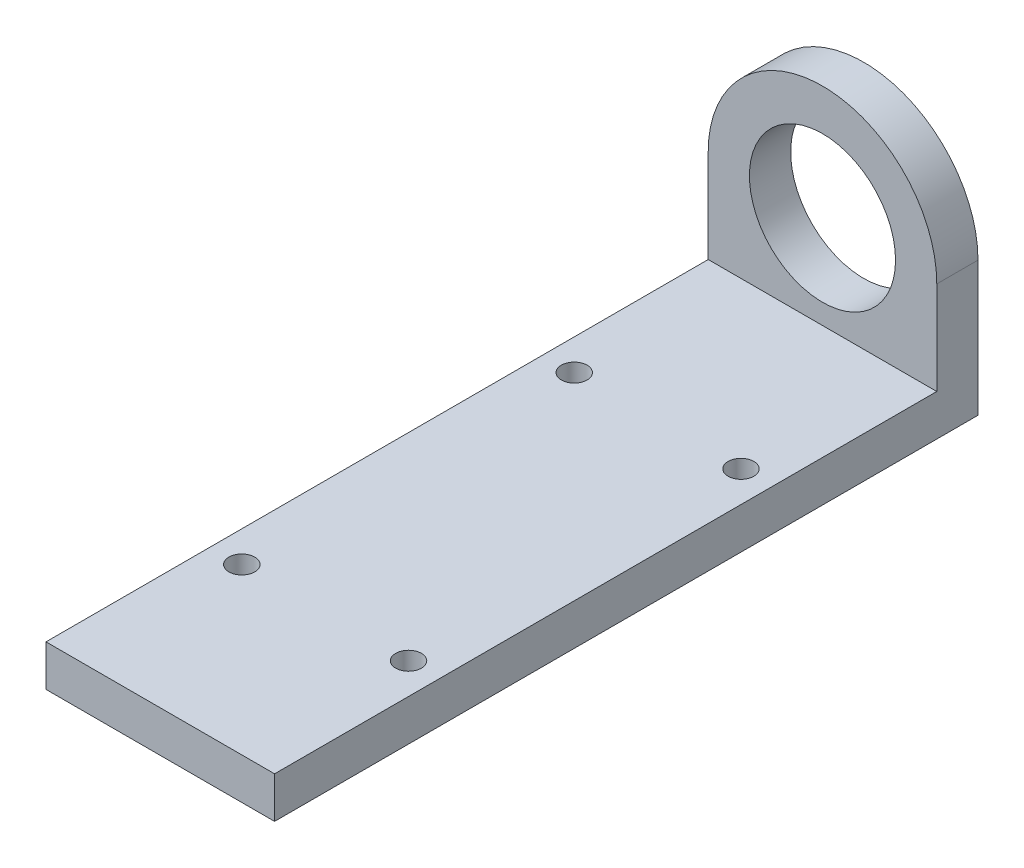
ISO-10303-21;
HEADER;
FILE_DESCRIPTION(('STEP AP214'),'2;1');
FILE_NAME('part.step','',(''),(''),'','','');
FILE_SCHEMA(('AUTOMOTIVE_DESIGN { 1 0 10303 214 1 1 1 1 }'));
ENDSEC;
DATA;
#1=APPLICATION_CONTEXT('core data for automotive mechanical design processes');
#2=APPLICATION_PROTOCOL_DEFINITION('international standard','automotive_design',2000,#1);
#3=PRODUCT_CONTEXT('',#1,'mechanical');
#4=PRODUCT('Part','Part','',(#3));
#5=PRODUCT_RELATED_PRODUCT_CATEGORY('part','',(#4));
#6=PRODUCT_DEFINITION_FORMATION('','',#4);
#7=PRODUCT_DEFINITION_CONTEXT('part definition',#1,'design');
#8=PRODUCT_DEFINITION('design','',#6,#7);
#9=PRODUCT_DEFINITION_SHAPE('','',#8);
#10=(LENGTH_UNIT() NAMED_UNIT(*) SI_UNIT(.MILLI.,.METRE.));
#11=(NAMED_UNIT(*) PLANE_ANGLE_UNIT() SI_UNIT($,.RADIAN.));
#12=(NAMED_UNIT(*) SI_UNIT($,.STERADIAN.) SOLID_ANGLE_UNIT());
#13=UNCERTAINTY_MEASURE_WITH_UNIT(LENGTH_MEASURE(1.E-05),#10,'distance_accuracy_value','');
#14=(GEOMETRIC_REPRESENTATION_CONTEXT(3) GLOBAL_UNCERTAINTY_ASSIGNED_CONTEXT((#13)) GLOBAL_UNIT_ASSIGNED_CONTEXT((#10,
#11,#12)) REPRESENTATION_CONTEXT('',''));
#15=CARTESIAN_POINT('',(0.,0.,0.));
#16=DIRECTION('',(0.,0.,1.));
#17=DIRECTION('',(1.,0.,0.));
#18=AXIS2_PLACEMENT_3D('',#15,#16,#17);
#19=CARTESIAN_POINT('',(0.,0.,6.35));
#20=DIRECTION('',(0.,0.,1.));
#21=DIRECTION('',(1.,0.,0.));
#22=AXIS2_PLACEMENT_3D('',#19,#20,#21);
#23=PLANE('',#22);
#24=DIRECTION('',(-1.,0.,0.));
#25=VECTOR('',#24,1.);
#26=CARTESIAN_POINT('',(-17.604,-14.35,6.35));
#27=LINE('',#26,#25);
#28=CARTESIAN_POINT('',(17.604,-14.35,6.35));
#29=VERTEX_POINT('',#28);
#30=CARTESIAN_POINT('',(-17.604,-14.35,6.35));
#31=VERTEX_POINT('',#30);
#32=EDGE_CURVE('E54',#29,#31,#27,.T.);
#33=ORIENTED_EDGE('',*,*,#32,.F.);
#34=DIRECTION('',(0.,1.,0.));
#35=VECTOR('',#34,1.);
#36=CARTESIAN_POINT('',(17.604,-20.7,6.35));
#37=LINE('',#36,#35);
#38=CARTESIAN_POINT('',(17.604,0.,6.35));
#39=VERTEX_POINT('',#38);
#40=EDGE_CURVE('E59',#29,#39,#37,.T.);
#41=ORIENTED_EDGE('',*,*,#40,.T.);
#42=CARTESIAN_POINT('',(0.,0.,6.35));
#43=DIRECTION('',(0.,0.,1.));
#44=DIRECTION('',(1.,0.,0.));
#45=AXIS2_PLACEMENT_3D('',#42,#43,#44);
#46=CIRCLE('',#45,17.604);
#47=CARTESIAN_POINT('',(-17.604,0.,6.35));
#48=VERTEX_POINT('',#47);
#49=EDGE_CURVE('E90',#39,#48,#46,.T.);
#50=ORIENTED_EDGE('',*,*,#49,.T.);
#51=DIRECTION('',(0.,-1.,0.));
#52=VECTOR('',#51,1.);
#53=CARTESIAN_POINT('',(-17.604,0.,6.35));
#54=LINE('',#53,#52);
#55=EDGE_CURVE('E158',#48,#31,#54,.T.);
#56=ORIENTED_EDGE('',*,*,#55,.T.);
#57=EDGE_LOOP('',(#33,#41,#50,#56));
#58=FACE_BOUND('',#57,.T.);
#59=CARTESIAN_POINT('',(0.,0.,6.35));
#60=DIRECTION('',(0.,0.,1.));
#61=DIRECTION('',(1.,0.,0.));
#62=AXIS2_PLACEMENT_3D('',#59,#60,#61);
#63=CIRCLE('',#62,11.254);
#64=CARTESIAN_POINT('',(11.254,0.,6.35));
#65=VERTEX_POINT('',#64);
#66=EDGE_CURVE('E101',#65,#65,#63,.T.);
#67=ORIENTED_EDGE('',*,*,#66,.F.);
#68=EDGE_LOOP('',(#67));
#69=FACE_BOUND('',#68,.T.);
#70=ADVANCED_FACE('F39',(#58,#69),#23,.T.);
#71=CARTESIAN_POINT('',(0.,0.,0.));
#72=DIRECTION('',(0.,0.,1.));
#73=DIRECTION('',(1.,0.,0.));
#74=AXIS2_PLACEMENT_3D('',#71,#72,#73);
#75=PLANE('',#74);
#76=CARTESIAN_POINT('',(0.,0.,0.));
#77=DIRECTION('',(0.,0.,1.));
#78=DIRECTION('',(1.,0.,0.));
#79=AXIS2_PLACEMENT_3D('',#76,#77,#78);
#80=CIRCLE('',#79,17.604);
#81=CARTESIAN_POINT('',(17.604,0.,0.));
#82=VERTEX_POINT('',#81);
#83=CARTESIAN_POINT('',(-17.604,0.,0.));
#84=VERTEX_POINT('',#83);
#85=EDGE_CURVE('E96',#82,#84,#80,.T.);
#86=ORIENTED_EDGE('',*,*,#85,.F.);
#87=DIRECTION('',(0.,1.,0.));
#88=VECTOR('',#87,1.);
#89=CARTESIAN_POINT('',(17.604,-20.7,0.));
#90=LINE('',#89,#88);
#91=CARTESIAN_POINT('',(17.604,-20.7,0.));
#92=VERTEX_POINT('',#91);
#93=EDGE_CURVE('E79',#92,#82,#90,.T.);
#94=ORIENTED_EDGE('',*,*,#93,.F.);
#95=DIRECTION('',(1.,0.,0.));
#96=VECTOR('',#95,1.);
#97=CARTESIAN_POINT('',(-17.604,-20.7,0.));
#98=LINE('',#97,#96);
#99=CARTESIAN_POINT('',(-17.604,-20.7,0.));
#100=VERTEX_POINT('',#99);
#101=EDGE_CURVE('E91',#100,#92,#98,.T.);
#102=ORIENTED_EDGE('',*,*,#101,.F.);
#103=DIRECTION('',(0.,-1.,0.));
#104=VECTOR('',#103,1.);
#105=CARTESIAN_POINT('',(-17.604,0.,0.));
#106=LINE('',#105,#104);
#107=EDGE_CURVE('E100',#84,#100,#106,.T.);
#108=ORIENTED_EDGE('',*,*,#107,.F.);
#109=EDGE_LOOP('',(#86,#94,#102,#108));
#110=FACE_BOUND('',#109,.T.);
#111=CARTESIAN_POINT('',(0.,0.,0.));
#112=DIRECTION('',(0.,0.,1.));
#113=DIRECTION('',(1.,0.,0.));
#114=AXIS2_PLACEMENT_3D('',#111,#112,#113);
#115=CIRCLE('',#114,11.254);
#116=CARTESIAN_POINT('',(11.254,0.,0.));
#117=VERTEX_POINT('',#116);
#118=EDGE_CURVE('E105',#117,#117,#115,.T.);
#119=ORIENTED_EDGE('',*,*,#118,.T.);
#120=EDGE_LOOP('',(#119));
#121=FACE_BOUND('',#120,.T.);
#122=ADVANCED_FACE('F98',(#110,#121),#75,.F.);
#123=CARTESIAN_POINT('',(0.,0.,6.35));
#124=DIRECTION('',(0.,0.,-1.));
#125=DIRECTION('',(-1.,0.,0.));
#126=AXIS2_PLACEMENT_3D('',#123,#124,#125);
#127=CYLINDRICAL_SURFACE('',#126,17.604);
#128=ORIENTED_EDGE('',*,*,#85,.T.);
#129=DIRECTION('',(0.,0.,-1.));
#130=VECTOR('',#129,1.);
#131=CARTESIAN_POINT('',(-17.604,0.,6.35));
#132=LINE('',#131,#130);
#133=EDGE_CURVE('E11',#48,#84,#132,.T.);
#134=ORIENTED_EDGE('',*,*,#133,.F.);
#135=ORIENTED_EDGE('',*,*,#49,.F.);
#136=DIRECTION('',(0.,0.,-1.));
#137=VECTOR('',#136,1.);
#138=CARTESIAN_POINT('',(17.604,0.,6.35));
#139=LINE('',#138,#137);
#140=EDGE_CURVE('E82',#39,#82,#139,.T.);
#141=ORIENTED_EDGE('',*,*,#140,.T.);
#142=EDGE_LOOP('',(#128,#134,#135,#141));
#143=FACE_BOUND('',#142,.T.);
#144=ADVANCED_FACE('F41',(#143),#127,.T.);
#145=CARTESIAN_POINT('',(-17.604,0.,6.35));
#146=DIRECTION('',(1.,0.,0.));
#147=DIRECTION('',(0.,1.,0.));
#148=AXIS2_PLACEMENT_3D('',#145,#146,#147);
#149=PLANE('',#148);
#150=ORIENTED_EDGE('',*,*,#107,.T.);
#151=DIRECTION('',(0.,0.,-1.));
#152=VECTOR('',#151,1.);
#153=CARTESIAN_POINT('',(-17.604,-20.7,6.35));
#154=LINE('',#153,#152);
#155=CARTESIAN_POINT('',(-17.604,-20.7,108.35));
#156=VERTEX_POINT('',#155);
#157=EDGE_CURVE('E47',#156,#100,#154,.T.);
#158=ORIENTED_EDGE('',*,*,#157,.F.);
#159=DIRECTION('',(0.,-1.,0.));
#160=VECTOR('',#159,1.);
#161=CARTESIAN_POINT('',(-17.604,-20.7,108.35));
#162=LINE('',#161,#160);
#163=CARTESIAN_POINT('',(-17.604,-14.35,108.35));
#164=VERTEX_POINT('',#163);
#165=EDGE_CURVE('E124',#164,#156,#162,.T.);
#166=ORIENTED_EDGE('',*,*,#165,.F.);
#167=DIRECTION('',(0.,0.,-1.));
#168=VECTOR('',#167,1.);
#169=CARTESIAN_POINT('',(-17.604,-14.35,144.126050145314));
#170=LINE('',#169,#168);
#171=EDGE_CURVE('E136',#164,#31,#170,.T.);
#172=ORIENTED_EDGE('',*,*,#171,.T.);
#173=ORIENTED_EDGE('',*,*,#55,.F.);
#174=ORIENTED_EDGE('',*,*,#133,.T.);
#175=EDGE_LOOP('',(#150,#158,#166,#172,#173,#174));
#176=FACE_BOUND('',#175,.T.);
#177=ADVANCED_FACE('F122',(#176),#149,.F.);
#178=CARTESIAN_POINT('',(-17.604,-20.7,6.35));
#179=DIRECTION('',(0.,1.,0.));
#180=DIRECTION('',(0.,0.,1.));
#181=AXIS2_PLACEMENT_3D('',#178,#179,#180);
#182=PLANE('',#181);
#183=CARTESIAN_POINT('',(-12.8415,-20.7,31.75));
#184=DIRECTION('',(0.,1.,0.));
#185=DIRECTION('',(0.,0.,-1.));
#186=AXIS2_PLACEMENT_3D('',#183,#184,#185);
#187=CIRCLE('',#186,1.984375);
#188=CARTESIAN_POINT('',(-12.8415,-20.7,29.765625));
#189=VERTEX_POINT('',#188);
#190=EDGE_CURVE('E289',#189,#189,#187,.T.);
#191=ORIENTED_EDGE('',*,*,#190,.T.);
#192=EDGE_LOOP('',(#191));
#193=FACE_BOUND('',#192,.T.);
#194=CARTESIAN_POINT('',(-12.8415,-20.7,82.95));
#195=DIRECTION('',(0.,1.,0.));
#196=DIRECTION('',(0.,0.,-1.));
#197=AXIS2_PLACEMENT_3D('',#194,#195,#196);
#198=CIRCLE('',#197,1.984375);
#199=CARTESIAN_POINT('',(-12.8415,-20.7,80.965625));
#200=VERTEX_POINT('',#199);
#201=EDGE_CURVE('E293',#200,#200,#198,.T.);
#202=ORIENTED_EDGE('',*,*,#201,.T.);
#203=EDGE_LOOP('',(#202));
#204=FACE_BOUND('',#203,.T.);
#205=CARTESIAN_POINT('',(12.8415,-20.7,82.95));
#206=DIRECTION('',(0.,1.,0.));
#207=DIRECTION('',(0.,0.,1.));
#208=AXIS2_PLACEMENT_3D('',#205,#206,#207);
#209=CIRCLE('',#208,1.984375);
#210=CARTESIAN_POINT('',(12.8415,-20.7,84.934375));
#211=VERTEX_POINT('',#210);
#212=EDGE_CURVE('E308',#211,#211,#209,.T.);
#213=ORIENTED_EDGE('',*,*,#212,.T.);
#214=EDGE_LOOP('',(#213));
#215=FACE_BOUND('',#214,.T.);
#216=CARTESIAN_POINT('',(12.8415,-20.7,31.75));
#217=DIRECTION('',(0.,1.,0.));
#218=DIRECTION('',(0.,0.,1.));
#219=AXIS2_PLACEMENT_3D('',#216,#217,#218);
#220=CIRCLE('',#219,1.984375);
#221=CARTESIAN_POINT('',(12.8415,-20.7,33.734375));
#222=VERTEX_POINT('',#221);
#223=EDGE_CURVE('E156',#222,#222,#220,.T.);
#224=ORIENTED_EDGE('',*,*,#223,.T.);
#225=EDGE_LOOP('',(#224));
#226=FACE_BOUND('',#225,.T.);
#227=ORIENTED_EDGE('',*,*,#101,.T.);
#228=DIRECTION('',(0.,0.,-1.));
#229=VECTOR('',#228,1.);
#230=CARTESIAN_POINT('',(17.604,-20.7,6.35));
#231=LINE('',#230,#229);
#232=CARTESIAN_POINT('',(17.604,-20.7,108.35));
#233=VERTEX_POINT('',#232);
#234=EDGE_CURVE('E86',#233,#92,#231,.T.);
#235=ORIENTED_EDGE('',*,*,#234,.F.);
#236=DIRECTION('',(1.,0.,0.));
#237=VECTOR('',#236,1.);
#238=CARTESIAN_POINT('',(-17.604,-20.7,108.35));
#239=LINE('',#238,#237);
#240=EDGE_CURVE('E118',#156,#233,#239,.T.);
#241=ORIENTED_EDGE('',*,*,#240,.F.);
#242=ORIENTED_EDGE('',*,*,#157,.T.);
#243=EDGE_LOOP('',(#227,#235,#241,#242));
#244=FACE_BOUND('',#243,.T.);
#245=ADVANCED_FACE('F115',(#193,#204,#215,#226,#244),#182,.F.);
#246=CARTESIAN_POINT('',(17.604,-20.7,6.35));
#247=DIRECTION('',(-1.,0.,0.));
#248=DIRECTION('',(0.,-1.,0.));
#249=AXIS2_PLACEMENT_3D('',#246,#247,#248);
#250=PLANE('',#249);
#251=ORIENTED_EDGE('',*,*,#93,.T.);
#252=ORIENTED_EDGE('',*,*,#140,.F.);
#253=ORIENTED_EDGE('',*,*,#40,.F.);
#254=DIRECTION('',(0.,0.,-1.));
#255=VECTOR('',#254,1.);
#256=CARTESIAN_POINT('',(17.604,-14.35,144.126050145314));
#257=LINE('',#256,#255);
#258=CARTESIAN_POINT('',(17.604,-14.35,108.35));
#259=VERTEX_POINT('',#258);
#260=EDGE_CURVE('E139',#259,#29,#257,.T.);
#261=ORIENTED_EDGE('',*,*,#260,.F.);
#262=DIRECTION('',(0.,1.,0.));
#263=VECTOR('',#262,1.);
#264=CARTESIAN_POINT('',(17.604,-20.7,108.35));
#265=LINE('',#264,#263);
#266=EDGE_CURVE('E141',#233,#259,#265,.T.);
#267=ORIENTED_EDGE('',*,*,#266,.F.);
#268=ORIENTED_EDGE('',*,*,#234,.T.);
#269=EDGE_LOOP('',(#251,#252,#253,#261,#267,#268));
#270=FACE_BOUND('',#269,.T.);
#271=ADVANCED_FACE('F81',(#270),#250,.F.);
#272=CARTESIAN_POINT('',(0.,0.,6.35));
#273=DIRECTION('',(0.,0.,-1.));
#274=DIRECTION('',(-1.,0.,0.));
#275=AXIS2_PLACEMENT_3D('',#272,#273,#274);
#276=CYLINDRICAL_SURFACE('',#275,11.254);
#277=ORIENTED_EDGE('',*,*,#66,.T.);
#278=EDGE_LOOP('',(#277));
#279=FACE_BOUND('',#278,.T.);
#280=ORIENTED_EDGE('',*,*,#118,.F.);
#281=EDGE_LOOP('',(#280));
#282=FACE_BOUND('',#281,.T.);
#283=ADVANCED_FACE('F164',(#279,#282),#276,.F.);
#284=CARTESIAN_POINT('',(-17.604,-14.35,144.126050145314));
#285=DIRECTION('',(0.,-1.,0.));
#286=DIRECTION('',(0.,0.,-1.));
#287=AXIS2_PLACEMENT_3D('',#284,#285,#286);
#288=PLANE('',#287);
#289=CARTESIAN_POINT('',(-12.8415,-14.35,31.75));
#290=DIRECTION('',(0.,1.,0.));
#291=DIRECTION('',(0.,0.,-1.));
#292=AXIS2_PLACEMENT_3D('',#289,#290,#291);
#293=CIRCLE('',#292,1.984375);
#294=CARTESIAN_POINT('',(-12.8415,-14.35,29.765625));
#295=VERTEX_POINT('',#294);
#296=EDGE_CURVE('E292',#295,#295,#293,.T.);
#297=ORIENTED_EDGE('',*,*,#296,.F.);
#298=EDGE_LOOP('',(#297));
#299=FACE_BOUND('',#298,.T.);
#300=CARTESIAN_POINT('',(-12.8415,-14.35,82.95));
#301=DIRECTION('',(0.,1.,0.));
#302=DIRECTION('',(0.,0.,-1.));
#303=AXIS2_PLACEMENT_3D('',#300,#301,#302);
#304=CIRCLE('',#303,1.984375);
#305=CARTESIAN_POINT('',(-12.8415,-14.35,80.965625));
#306=VERTEX_POINT('',#305);
#307=EDGE_CURVE('E296',#306,#306,#304,.T.);
#308=ORIENTED_EDGE('',*,*,#307,.F.);
#309=EDGE_LOOP('',(#308));
#310=FACE_BOUND('',#309,.T.);
#311=CARTESIAN_POINT('',(12.8415,-14.35,82.95));
#312=DIRECTION('',(0.,1.,0.));
#313=DIRECTION('',(0.,0.,1.));
#314=AXIS2_PLACEMENT_3D('',#311,#312,#313);
#315=CIRCLE('',#314,1.984375);
#316=CARTESIAN_POINT('',(12.8415,-14.35,84.934375));
#317=VERTEX_POINT('',#316);
#318=EDGE_CURVE('E304',#317,#317,#315,.T.);
#319=ORIENTED_EDGE('',*,*,#318,.F.);
#320=EDGE_LOOP('',(#319));
#321=FACE_BOUND('',#320,.T.);
#322=CARTESIAN_POINT('',(12.8415,-14.35,31.75));
#323=DIRECTION('',(0.,1.,0.));
#324=DIRECTION('',(0.,0.,1.));
#325=AXIS2_PLACEMENT_3D('',#322,#323,#324);
#326=CIRCLE('',#325,1.984375);
#327=CARTESIAN_POINT('',(12.8415,-14.35,33.734375));
#328=VERTEX_POINT('',#327);
#329=EDGE_CURVE('E302',#328,#328,#326,.T.);
#330=ORIENTED_EDGE('',*,*,#329,.F.);
#331=EDGE_LOOP('',(#330));
#332=FACE_BOUND('',#331,.T.);
#333=DIRECTION('',(-1.,0.,0.));
#334=VECTOR('',#333,1.);
#335=CARTESIAN_POINT('',(-17.604,-14.35,108.35));
#336=LINE('',#335,#334);
#337=EDGE_CURVE('E143',#259,#164,#336,.T.);
#338=ORIENTED_EDGE('',*,*,#337,.F.);
#339=ORIENTED_EDGE('',*,*,#260,.T.);
#340=ORIENTED_EDGE('',*,*,#32,.T.);
#341=ORIENTED_EDGE('',*,*,#171,.F.);
#342=EDGE_LOOP('',(#338,#339,#340,#341));
#343=FACE_BOUND('',#342,.T.);
#344=ADVANCED_FACE('F144',(#299,#310,#321,#332,#343),#288,.F.);
#345=CARTESIAN_POINT('',(0.,0.,108.35));
#346=DIRECTION('',(0.,0.,1.));
#347=DIRECTION('',(0.,1.,0.));
#348=AXIS2_PLACEMENT_3D('',#345,#346,#347);
#349=PLANE('',#348);
#350=ORIENTED_EDGE('',*,*,#337,.T.);
#351=ORIENTED_EDGE('',*,*,#165,.T.);
#352=ORIENTED_EDGE('',*,*,#240,.T.);
#353=ORIENTED_EDGE('',*,*,#266,.T.);
#354=EDGE_LOOP('',(#350,#351,#352,#353));
#355=FACE_BOUND('',#354,.T.);
#356=ADVANCED_FACE('F147',(#355),#349,.T.);
#357=CARTESIAN_POINT('',(12.8415,-20.7,31.75));
#358=DIRECTION('',(0.,1.,0.));
#359=DIRECTION('',(0.,0.,1.));
#360=AXIS2_PLACEMENT_3D('',#357,#358,#359);
#361=CYLINDRICAL_SURFACE('',#360,1.984375);
#362=ORIENTED_EDGE('',*,*,#223,.F.);
#363=EDGE_LOOP('',(#362));
#364=FACE_BOUND('',#363,.T.);
#365=ORIENTED_EDGE('',*,*,#329,.T.);
#366=EDGE_LOOP('',(#365));
#367=FACE_BOUND('',#366,.T.);
#368=ADVANCED_FACE('F198',(#364,#367),#361,.F.);
#369=CARTESIAN_POINT('',(12.8415,-20.7,82.95));
#370=DIRECTION('',(0.,1.,0.));
#371=DIRECTION('',(0.,0.,1.));
#372=AXIS2_PLACEMENT_3D('',#369,#370,#371);
#373=CYLINDRICAL_SURFACE('',#372,1.984375);
#374=ORIENTED_EDGE('',*,*,#212,.F.);
#375=EDGE_LOOP('',(#374));
#376=FACE_BOUND('',#375,.T.);
#377=ORIENTED_EDGE('',*,*,#318,.T.);
#378=EDGE_LOOP('',(#377));
#379=FACE_BOUND('',#378,.T.);
#380=ADVANCED_FACE('F218',(#376,#379),#373,.F.);
#381=CARTESIAN_POINT('',(-12.8415,-20.7,82.95));
#382=DIRECTION('',(0.,1.,0.));
#383=DIRECTION('',(0.,0.,1.));
#384=AXIS2_PLACEMENT_3D('',#381,#382,#383);
#385=CYLINDRICAL_SURFACE('',#384,1.984375);
#386=ORIENTED_EDGE('',*,*,#201,.F.);
#387=EDGE_LOOP('',(#386));
#388=FACE_BOUND('',#387,.T.);
#389=ORIENTED_EDGE('',*,*,#307,.T.);
#390=EDGE_LOOP('',(#389));
#391=FACE_BOUND('',#390,.T.);
#392=ADVANCED_FACE('F227',(#388,#391),#385,.F.);
#393=CARTESIAN_POINT('',(-12.8415,-20.7,31.75));
#394=DIRECTION('',(0.,1.,0.));
#395=DIRECTION('',(0.,0.,1.));
#396=AXIS2_PLACEMENT_3D('',#393,#394,#395);
#397=CYLINDRICAL_SURFACE('',#396,1.984375);
#398=ORIENTED_EDGE('',*,*,#190,.F.);
#399=EDGE_LOOP('',(#398));
#400=FACE_BOUND('',#399,.T.);
#401=ORIENTED_EDGE('',*,*,#296,.T.);
#402=EDGE_LOOP('',(#401));
#403=FACE_BOUND('',#402,.T.);
#404=ADVANCED_FACE('F236',(#400,#403),#397,.F.);
#405=CLOSED_SHELL('',(#70,#122,#144,#177,#245,#271,#283,#344,#356,#368,#380,#392,#404));
#406=MANIFOLD_SOLID_BREP('B2',#405);
#407=ADVANCED_BREP_SHAPE_REPRESENTATION('',(#18,#406),#14);
#408=SHAPE_DEFINITION_REPRESENTATION(#9,#407);
ENDSEC;
END-ISO-10303-21;
